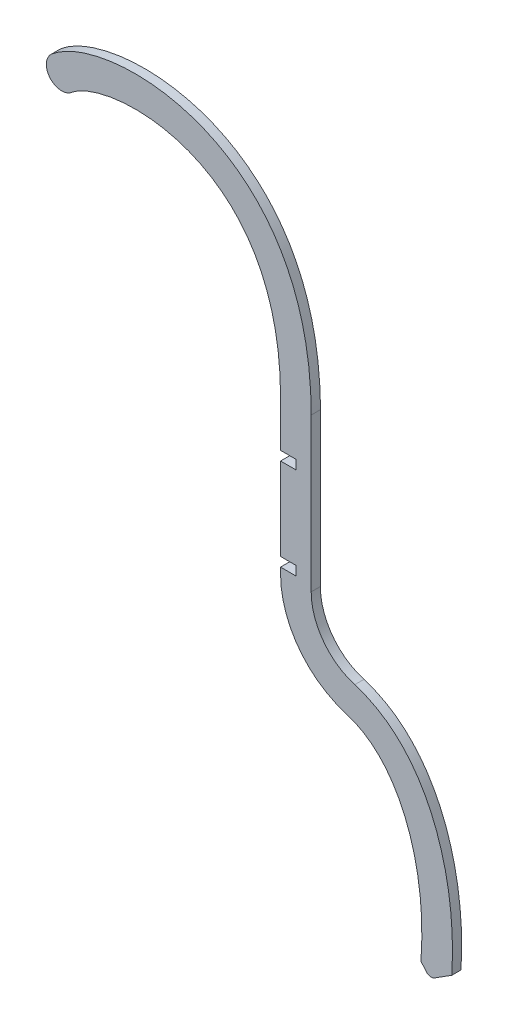
ISO-10303-21;
HEADER;
FILE_DESCRIPTION(('STEP AP214'),'2;1');
FILE_NAME('part.step','',(''),(''),'','','');
FILE_SCHEMA(('AUTOMOTIVE_DESIGN { 1 0 10303 214 1 1 1 1 }'));
ENDSEC;
DATA;
#1=APPLICATION_CONTEXT('core data for automotive mechanical design processes');
#2=APPLICATION_PROTOCOL_DEFINITION('international standard','automotive_design',2000,#1);
#3=PRODUCT_CONTEXT('',#1,'mechanical');
#4=PRODUCT('Part','Part','',(#3));
#5=PRODUCT_RELATED_PRODUCT_CATEGORY('part','',(#4));
#6=PRODUCT_DEFINITION_FORMATION('','',#4);
#7=PRODUCT_DEFINITION_CONTEXT('part definition',#1,'design');
#8=PRODUCT_DEFINITION('design','',#6,#7);
#9=PRODUCT_DEFINITION_SHAPE('','',#8);
#10=(LENGTH_UNIT() NAMED_UNIT(*) SI_UNIT(.MILLI.,.METRE.));
#11=(NAMED_UNIT(*) PLANE_ANGLE_UNIT() SI_UNIT($,.RADIAN.));
#12=(NAMED_UNIT(*) SI_UNIT($,.STERADIAN.) SOLID_ANGLE_UNIT());
#13=UNCERTAINTY_MEASURE_WITH_UNIT(LENGTH_MEASURE(1.E-05),#10,'distance_accuracy_value','');
#14=(GEOMETRIC_REPRESENTATION_CONTEXT(3) GLOBAL_UNCERTAINTY_ASSIGNED_CONTEXT((#13)) GLOBAL_UNIT_ASSIGNED_CONTEXT((#10,
#11,#12)) REPRESENTATION_CONTEXT('',''));
#15=CARTESIAN_POINT('',(0.,0.,0.));
#16=DIRECTION('',(0.,0.,1.));
#17=DIRECTION('',(1.,0.,0.));
#18=AXIS2_PLACEMENT_3D('',#15,#16,#17);
#19=CARTESIAN_POINT('',(30.2472330755642,111.105178128736,3.));
#20=DIRECTION('',(1.,0.,0.));
#21=DIRECTION('',(0.,1.,0.));
#22=AXIS2_PLACEMENT_3D('',#19,#20,#21);
#23=PLANE('',#22);
#24=DIRECTION('',(0.,0.,1.));
#25=VECTOR('',#24,1.);
#26=CARTESIAN_POINT('',(30.2472330755642,93.1051781287361,3.));
#27=LINE('',#26,#25);
#28=CARTESIAN_POINT('',(30.2472330755642,93.1051781287361,0.));
#29=VERTEX_POINT('',#28);
#30=CARTESIAN_POINT('',(30.2472330755642,93.1051781287361,3.));
#31=VERTEX_POINT('',#30);
#32=EDGE_CURVE('E300',#29,#31,#27,.T.);
#33=ORIENTED_EDGE('',*,*,#32,.F.);
#34=DIRECTION('',(0.,-1.,0.));
#35=VECTOR('',#34,1.);
#36=CARTESIAN_POINT('',(30.2472330755642,111.105178128736,0.));
#37=LINE('',#36,#35);
#38=CARTESIAN_POINT('',(30.2472330755642,66.1051781287361,0.));
#39=VERTEX_POINT('',#38);
#40=EDGE_CURVE('E380',#29,#39,#37,.T.);
#41=ORIENTED_EDGE('',*,*,#40,.T.);
#42=DIRECTION('',(0.,0.,1.));
#43=VECTOR('',#42,1.);
#44=CARTESIAN_POINT('',(30.2472330755642,66.1051781287361,3.));
#45=LINE('',#44,#43);
#46=CARTESIAN_POINT('',(30.2472330755642,66.1051781287361,3.));
#47=VERTEX_POINT('',#46);
#48=EDGE_CURVE('E295',#39,#47,#45,.T.);
#49=ORIENTED_EDGE('',*,*,#48,.T.);
#50=DIRECTION('',(0.,-1.,0.));
#51=VECTOR('',#50,1.);
#52=CARTESIAN_POINT('',(30.2472330755642,111.105178128736,3.));
#53=LINE('',#52,#51);
#54=EDGE_CURVE('E338',#31,#47,#53,.T.);
#55=ORIENTED_EDGE('',*,*,#54,.F.);
#56=EDGE_LOOP('',(#33,#41,#49,#55));
#57=FACE_BOUND('',#56,.T.);
#58=ADVANCED_FACE('F39',(#57),#23,.F.);
#59=DIRECTION('',(0.,0.,1.));
#60=VECTOR('',#59,1.);
#61=CARTESIAN_POINT('',(30.2472330755642,63.1051781287361,3.));
#62=LINE('',#61,#60);
#63=CARTESIAN_POINT('',(30.2472330755642,63.1051781287361,0.));
#64=VERTEX_POINT('',#63);
#65=CARTESIAN_POINT('',(30.2472330755642,63.1051781287361,3.));
#66=VERTEX_POINT('',#65);
#67=EDGE_CURVE('E270',#64,#66,#62,.T.);
#68=ORIENTED_EDGE('',*,*,#67,.F.);
#69=CARTESIAN_POINT('',(30.2472330755642,61.1051781287361,0.));
#70=VERTEX_POINT('',#69);
#71=EDGE_CURVE('E334',#64,#70,#37,.T.);
#72=ORIENTED_EDGE('',*,*,#71,.T.);
#73=DIRECTION('',(0.,0.,-1.));
#74=VECTOR('',#73,1.);
#75=CARTESIAN_POINT('',(30.2472330755642,61.1051781287361,3.));
#76=LINE('',#75,#74);
#77=CARTESIAN_POINT('',(30.2472330755642,61.1051781287361,3.));
#78=VERTEX_POINT('',#77);
#79=EDGE_CURVE('E429',#78,#70,#76,.T.);
#80=ORIENTED_EDGE('',*,*,#79,.F.);
#81=EDGE_CURVE('E339',#66,#78,#53,.T.);
#82=ORIENTED_EDGE('',*,*,#81,.F.);
#83=EDGE_LOOP('',(#68,#72,#80,#82));
#84=FACE_BOUND('',#83,.T.);
#85=ADVANCED_FACE('F368',(#84),#23,.F.);
#86=CARTESIAN_POINT('',(30.2472330755642,111.105178128736,0.));
#87=VERTEX_POINT('',#86);
#88=CARTESIAN_POINT('',(30.2472330755642,96.1051781287361,0.));
#89=VERTEX_POINT('',#88);
#90=EDGE_CURVE('E390',#87,#89,#37,.T.);
#91=ORIENTED_EDGE('',*,*,#90,.T.);
#92=DIRECTION('',(0.,0.,1.));
#93=VECTOR('',#92,1.);
#94=CARTESIAN_POINT('',(30.2472330755642,96.1051781287361,3.));
#95=LINE('',#94,#93);
#96=CARTESIAN_POINT('',(30.2472330755642,96.1051781287361,3.));
#97=VERTEX_POINT('',#96);
#98=EDGE_CURVE('E305',#89,#97,#95,.T.);
#99=ORIENTED_EDGE('',*,*,#98,.T.);
#100=CARTESIAN_POINT('',(30.2472330755642,111.105178128736,3.));
#101=VERTEX_POINT('',#100);
#102=EDGE_CURVE('E335',#101,#97,#53,.T.);
#103=ORIENTED_EDGE('',*,*,#102,.F.);
#104=DIRECTION('',(0.,0.,-1.));
#105=VECTOR('',#104,1.);
#106=CARTESIAN_POINT('',(30.2472330755642,111.105178128736,3.));
#107=LINE('',#106,#105);
#108=EDGE_CURVE('E216',#101,#87,#107,.T.);
#109=ORIENTED_EDGE('',*,*,#108,.T.);
#110=EDGE_LOOP('',(#91,#99,#103,#109));
#111=FACE_BOUND('',#110,.T.);
#112=ADVANCED_FACE('F41',(#111),#23,.F.);
#113=CARTESIAN_POINT('',(60.2472330755642,61.1051781287361,3.));
#114=DIRECTION('',(0.,0.,-1.));
#115=DIRECTION('',(-1.,0.,0.));
#116=AXIS2_PLACEMENT_3D('',#113,#114,#115);
#117=CYLINDRICAL_SURFACE('',#116,30.);
#118=CARTESIAN_POINT('',(60.2472330755642,61.1051781287361,0.));
#119=DIRECTION('',(0.,0.,1.));
#120=DIRECTION('',(1.,0.,0.));
#121=AXIS2_PLACEMENT_3D('',#118,#119,#120);
#122=CIRCLE('',#121,30.);
#123=CARTESIAN_POINT('',(51.5783245461013,32.3849757459567,0.));
#124=VERTEX_POINT('',#123);
#125=EDGE_CURVE('E393',#70,#124,#122,.T.);
#126=ORIENTED_EDGE('',*,*,#125,.T.);
#127=DIRECTION('',(0.,0.,-1.));
#128=VECTOR('',#127,1.);
#129=CARTESIAN_POINT('',(51.5783245461013,32.3849757459567,3.));
#130=LINE('',#129,#128);
#131=CARTESIAN_POINT('',(51.5783245461013,32.3849757459567,3.));
#132=VERTEX_POINT('',#131);
#133=EDGE_CURVE('E426',#132,#124,#130,.T.);
#134=ORIENTED_EDGE('',*,*,#133,.F.);
#135=CARTESIAN_POINT('',(60.2472330755642,61.1051781287361,3.));
#136=DIRECTION('',(0.,0.,1.));
#137=DIRECTION('',(1.,0.,0.));
#138=AXIS2_PLACEMENT_3D('',#135,#136,#137);
#139=CIRCLE('',#138,30.);
#140=EDGE_CURVE('E337',#78,#132,#139,.T.);
#141=ORIENTED_EDGE('',*,*,#140,.F.);
#142=ORIENTED_EDGE('',*,*,#79,.T.);
#143=EDGE_LOOP('',(#126,#134,#141,#142));
#144=FACE_BOUND('',#143,.T.);
#145=ADVANCED_FACE('F360',(#144),#117,.T.);
#146=CARTESIAN_POINT('',(51.5783245461013,32.3849757459567,3.));
#147=CARTESIAN_POINT('',(52.4418237474786,32.1243370675715,3.));
#148=CARTESIAN_POINT('',(54.160244695127,31.5041732941851,3.));
#149=CARTESIAN_POINT('',(57.3068480949443,29.9703545295423,3.));
#150=CARTESIAN_POINT('',(60.9092601517179,27.4640028905668,3.));
#151=CARTESIAN_POINT('',(64.7789113425041,23.4878427324668,3.));
#152=CARTESIAN_POINT('',(69.3337224846496,16.8889121106159,3.));
#153=CARTESIAN_POINT('',(73.7131899847158,6.38380492162644,3.));
#154=CARTESIAN_POINT('',(76.4393028225739,-8.61752881826473,3.));
#155=CARTESIAN_POINT('',(76.5234079166854,-21.8927167166831,3.));
#156=CARTESIAN_POINT('',(75.3368048169374,-32.2481326739936,3.));
#157=CARTESIAN_POINT('',(73.8512799930039,-39.6983401019073,3.));
#158=CARTESIAN_POINT('',(71.8117544691769,-46.6469231762444,3.));
#159=CARTESIAN_POINT('',(69.6998429414444,-51.8638052622201,3.));
#160=CARTESIAN_POINT('',(67.8067562733463,-55.6012721850078,3.));
#161=CARTESIAN_POINT('',(66.2988758888052,-58.1660065714299,3.));
#162=CARTESIAN_POINT('',(64.9856806027951,-60.0849481600171,3.));
#163=CARTESIAN_POINT('',(63.9040927418651,-61.4887999643172,3.));
#164=CARTESIAN_POINT('',(63.3660237976318,-62.1329634196774,3.));
#165=CARTESIAN_POINT('',(63.0865626162944,-62.4536589435812,3.));
#166=B_SPLINE_CURVE_WITH_KNOTS('',3,(#146,#147,#148,#149,#150,#151,#152,#153,#154,#155,#156,
#157,#158,#159,#160,#161,#162,#163,#164,#165),.UNSPECIFIED.,.F.,.F.,(4,1,1,1,1,1,1,1,1,1,1,1,1,
1,1,1,1,4),(0.0736016129873298,0.102551562581476,0.131501512175622,0.189401411363914,
0.247301310552205,0.305201209740497,0.421001008117081,0.536800806493665,0.652600604870249,
0.710500504058541,0.768400403246832,0.826300302435124,0.884200201623416,0.913150151217562,
0.942100100811708,0.971050050405854,0.985525025202927,1.),.UNSPECIFIED.);
#167=DIRECTION('',(0.,0.,-1.));
#168=VECTOR('',#167,1.);
#169=SURFACE_OF_LINEAR_EXTRUSION('',#166,#168);
#170=CARTESIAN_POINT('',(51.5783245461013,32.3849757459567,0.));
#171=CARTESIAN_POINT('',(52.4418237474786,32.1243370675715,0.));
#172=CARTESIAN_POINT('',(54.160244695127,31.5041732941851,0.));
#173=CARTESIAN_POINT('',(57.3068480949443,29.9703545295423,0.));
#174=CARTESIAN_POINT('',(60.9092601517179,27.4640028905668,0.));
#175=CARTESIAN_POINT('',(64.7789113425041,23.4878427324668,0.));
#176=CARTESIAN_POINT('',(69.3337224846496,16.8889121106159,0.));
#177=CARTESIAN_POINT('',(73.7131899847158,6.38380492162644,0.));
#178=CARTESIAN_POINT('',(76.4393028225739,-8.61752881826473,0.));
#179=CARTESIAN_POINT('',(76.5234079166854,-21.8927167166831,0.));
#180=CARTESIAN_POINT('',(75.3368048169374,-32.2481326739936,0.));
#181=CARTESIAN_POINT('',(73.8512799930039,-39.6983401019073,0.));
#182=CARTESIAN_POINT('',(71.8117544691769,-46.6469231762444,0.));
#183=CARTESIAN_POINT('',(69.6998429414444,-51.8638052622201,0.));
#184=CARTESIAN_POINT('',(67.8067562733463,-55.6012721850078,0.));
#185=CARTESIAN_POINT('',(66.2988758888052,-58.1660065714299,0.));
#186=CARTESIAN_POINT('',(64.9856806027951,-60.0849481600171,0.));
#187=CARTESIAN_POINT('',(63.9040927418651,-61.4887999643172,0.));
#188=CARTESIAN_POINT('',(63.3660237976318,-62.1329634196774,0.));
#189=CARTESIAN_POINT('',(63.0865626162944,-62.4536589435812,0.));
#190=B_SPLINE_CURVE_WITH_KNOTS('',3,(#170,#171,#172,#173,#174,#175,#176,#177,#178,#179,#180,
#181,#182,#183,#184,#185,#186,#187,#188,#189),.UNSPECIFIED.,.F.,.F.,(4,1,1,1,1,1,1,1,1,1,1,1,1,
1,1,1,1,4),(0.0736016129873298,0.102551562581476,0.131501512175622,0.189401411363914,
0.247301310552205,0.305201209740497,0.421001008117081,0.536800806493665,0.652600604870249,
0.710500504058541,0.768400403246832,0.826300302435124,0.884200201623416,0.913150151217562,
0.942100100811708,0.971050050405854,0.985525025202927,1.),.UNSPECIFIED.);
#191=CARTESIAN_POINT('',(76.0488444966909,-25.3953063540741,0.));
#192=VERTEX_POINT('',#191);
#193=EDGE_CURVE('E398',#124,#192,#190,.T.);
#194=ORIENTED_EDGE('',*,*,#193,.T.);
#195=DIRECTION('',(0.,0.,-1.));
#196=VECTOR('',#195,1.);
#197=CARTESIAN_POINT('',(76.0488444966956,-25.3953063540795,3.));
#198=LINE('',#197,#196);
#199=CARTESIAN_POINT('',(76.0488444966909,-25.3953063540741,3.));
#200=VERTEX_POINT('',#199);
#201=EDGE_CURVE('E331',#192,#200,#198,.F.);
#202=ORIENTED_EDGE('',*,*,#201,.T.);
#203=EDGE_CURVE('E341',#132,#200,#166,.T.);
#204=ORIENTED_EDGE('',*,*,#203,.F.);
#205=ORIENTED_EDGE('',*,*,#133,.T.);
#206=EDGE_LOOP('',(#194,#202,#204,#205));
#207=FACE_BOUND('',#206,.T.);
#208=ADVANCED_FACE('F356',(#207),#169,.F.);
#209=CARTESIAN_POINT('',(70.6256816408782,-69.0234142155192,3.));
#210=CARTESIAN_POINT('',(94.0603865040222,-42.1309316258111,3.));
#211=CARTESIAN_POINT('',(93.4691575994557,30.1862516868117,3.));
#212=CARTESIAN_POINT('',(54.4679607225889,41.9583765402165,3.));
#213=B_SPLINE_CURVE_WITH_KNOTS('',3,(#209,#210,#211,#212),.UNSPECIFIED.,.F.,.F.,(4,4),
(0.0736016129873298,1.),.UNSPECIFIED.);
#214=DIRECTION('',(0.,0.,-1.));
#215=VECTOR('',#214,1.);
#216=SURFACE_OF_LINEAR_EXTRUSION('',#213,#215);
#217=CARTESIAN_POINT('',(86.1515531886918,-24.38839271404,3.));
#218=VERTEX_POINT('',#217);
#219=CARTESIAN_POINT('',(54.4679607225889,41.9583765402165,3.));
#220=VERTEX_POINT('',#219);
#221=EDGE_CURVE('E347',#218,#220,#213,.T.);
#222=ORIENTED_EDGE('',*,*,#221,.F.);
#223=DIRECTION('',(0.,0.,-1.));
#224=VECTOR('',#223,1.);
#225=CARTESIAN_POINT('',(86.1515531888008,-24.3883927139711,3.));
#226=LINE('',#225,#224);
#227=CARTESIAN_POINT('',(86.1515531886918,-24.38839271404,0.));
#228=VERTEX_POINT('',#227);
#229=EDGE_CURVE('E326',#218,#228,#226,.T.);
#230=ORIENTED_EDGE('',*,*,#229,.T.);
#231=CARTESIAN_POINT('',(70.6256816408782,-69.0234142155192,0.));
#232=CARTESIAN_POINT('',(94.0603865040222,-42.1309316258111,0.));
#233=CARTESIAN_POINT('',(93.4691575994557,30.1862516868117,0.));
#234=CARTESIAN_POINT('',(54.4679607225889,41.9583765402165,0.));
#235=B_SPLINE_CURVE_WITH_KNOTS('',3,(#231,#232,#233,#234),.UNSPECIFIED.,.F.,.F.,(4,4),
(0.0736016129873298,1.),.UNSPECIFIED.);
#236=CARTESIAN_POINT('',(54.4679607225889,41.9583765402165,0.));
#237=VERTEX_POINT('',#236);
#238=EDGE_CURVE('E403',#228,#237,#235,.T.);
#239=ORIENTED_EDGE('',*,*,#238,.T.);
#240=DIRECTION('',(0.,0.,-1.));
#241=VECTOR('',#240,1.);
#242=CARTESIAN_POINT('',(54.4679607225889,41.9583765402165,3.));
#243=LINE('',#242,#241);
#244=EDGE_CURVE('E423',#220,#237,#243,.T.);
#245=ORIENTED_EDGE('',*,*,#244,.F.);
#246=EDGE_LOOP('',(#222,#230,#239,#245));
#247=FACE_BOUND('',#246,.T.);
#248=ADVANCED_FACE('F359',(#247),#216,.F.);
#249=CARTESIAN_POINT('',(60.2472330755642,61.1051781287361,3.));
#250=DIRECTION('',(0.,0.,-1.));
#251=DIRECTION('',(-1.,0.,0.));
#252=AXIS2_PLACEMENT_3D('',#249,#250,#251);
#253=CYLINDRICAL_SURFACE('',#252,20.);
#254=CARTESIAN_POINT('',(60.2472330755642,61.1051781287361,0.));
#255=DIRECTION('',(0.,0.,-1.));
#256=DIRECTION('',(1.,0.,0.));
#257=AXIS2_PLACEMENT_3D('',#254,#255,#256);
#258=CIRCLE('',#257,20.);
#259=CARTESIAN_POINT('',(40.2472330755642,61.1051781287361,0.));
#260=VERTEX_POINT('',#259);
#261=EDGE_CURVE('E410',#237,#260,#258,.T.);
#262=ORIENTED_EDGE('',*,*,#261,.T.);
#263=DIRECTION('',(0.,0.,-1.));
#264=VECTOR('',#263,1.);
#265=CARTESIAN_POINT('',(40.2472330755642,61.1051781287361,3.));
#266=LINE('',#265,#264);
#267=CARTESIAN_POINT('',(40.2472330755642,61.1051781287361,3.));
#268=VERTEX_POINT('',#267);
#269=EDGE_CURVE('E420',#268,#260,#266,.T.);
#270=ORIENTED_EDGE('',*,*,#269,.F.);
#271=CARTESIAN_POINT('',(60.2472330755642,61.1051781287361,3.));
#272=DIRECTION('',(0.,0.,-1.));
#273=DIRECTION('',(1.,0.,0.));
#274=AXIS2_PLACEMENT_3D('',#271,#272,#273);
#275=CIRCLE('',#274,20.);
#276=EDGE_CURVE('E693',#220,#268,#275,.T.);
#277=ORIENTED_EDGE('',*,*,#276,.F.);
#278=ORIENTED_EDGE('',*,*,#244,.T.);
#279=EDGE_LOOP('',(#262,#270,#277,#278));
#280=FACE_BOUND('',#279,.T.);
#281=ADVANCED_FACE('F512',(#280),#253,.F.);
#282=CARTESIAN_POINT('',(40.2472330755642,111.105178128736,3.));
#283=DIRECTION('',(-1.,0.,0.));
#284=DIRECTION('',(0.,-1.,0.));
#285=AXIS2_PLACEMENT_3D('',#282,#283,#284);
#286=PLANE('',#285);
#287=DIRECTION('',(0.,1.,0.));
#288=VECTOR('',#287,1.);
#289=CARTESIAN_POINT('',(40.2472330755642,111.105178128736,0.));
#290=LINE('',#289,#288);
#291=CARTESIAN_POINT('',(40.2472330755642,111.105178128736,0.));
#292=VERTEX_POINT('',#291);
#293=EDGE_CURVE('E415',#260,#292,#290,.T.);
#294=ORIENTED_EDGE('',*,*,#293,.T.);
#295=DIRECTION('',(0.,0.,-1.));
#296=VECTOR('',#295,1.);
#297=CARTESIAN_POINT('',(40.2472330755642,111.105178128736,3.));
#298=LINE('',#297,#296);
#299=CARTESIAN_POINT('',(40.2472330755642,111.105178128736,3.));
#300=VERTEX_POINT('',#299);
#301=EDGE_CURVE('E417',#300,#292,#298,.T.);
#302=ORIENTED_EDGE('',*,*,#301,.F.);
#303=DIRECTION('',(0.,1.,0.));
#304=VECTOR('',#303,1.);
#305=CARTESIAN_POINT('',(40.2472330755642,111.105178128736,3.));
#306=LINE('',#305,#304);
#307=EDGE_CURVE('E396',#268,#300,#306,.T.);
#308=ORIENTED_EDGE('',*,*,#307,.F.);
#309=ORIENTED_EDGE('',*,*,#269,.T.);
#310=EDGE_LOOP('',(#294,#302,#308,#309));
#311=FACE_BOUND('',#310,.T.);
#312=ADVANCED_FACE('F508',(#311),#286,.F.);
#313=CARTESIAN_POINT('',(60.2472330755642,61.1051781287361,3.));
#314=DIRECTION('',(0.,0.,1.));
#315=DIRECTION('',(1.,0.,0.));
#316=AXIS2_PLACEMENT_3D('',#313,#314,#315);
#317=PLANE('',#316);
#318=DIRECTION('',(-1.,0.,0.));
#319=VECTOR('',#318,1.);
#320=CARTESIAN_POINT('',(60.2472330755642,96.1051781287361,3.));
#321=LINE('',#320,#319);
#322=CARTESIAN_POINT('',(35.2472330755643,96.1051781287361,3.00000000000034));
#323=VERTEX_POINT('',#322);
#324=EDGE_CURVE('E308',#323,#97,#321,.T.);
#325=ORIENTED_EDGE('',*,*,#324,.F.);
#326=DIRECTION('',(0.,1.,0.));
#327=VECTOR('',#326,1.);
#328=CARTESIAN_POINT('',(35.2472330755643,93.1041781287361,3.00000000000034));
#329=LINE('',#328,#327);
#330=CARTESIAN_POINT('',(35.2472330755643,93.1051781287361,3.00000000000034));
#331=VERTEX_POINT('',#330);
#332=EDGE_CURVE('E262',#331,#323,#329,.T.);
#333=ORIENTED_EDGE('',*,*,#332,.F.);
#334=DIRECTION('',(-1.,0.,0.));
#335=VECTOR('',#334,1.);
#336=CARTESIAN_POINT('',(60.2472330755642,93.1051781287361,3.));
#337=LINE('',#336,#335);
#338=EDGE_CURVE('E302',#331,#31,#337,.T.);
#339=ORIENTED_EDGE('',*,*,#338,.T.);
#340=ORIENTED_EDGE('',*,*,#54,.T.);
#341=DIRECTION('',(-1.,0.,0.));
#342=VECTOR('',#341,1.);
#343=CARTESIAN_POINT('',(60.2472330755642,66.1051781287361,3.));
#344=LINE('',#343,#342);
#345=CARTESIAN_POINT('',(35.2472330755642,66.1051781287361,3.00000000000001));
#346=VERTEX_POINT('',#345);
#347=EDGE_CURVE('E298',#346,#47,#344,.T.);
#348=ORIENTED_EDGE('',*,*,#347,.F.);
#349=DIRECTION('',(0.,1.,0.));
#350=VECTOR('',#349,1.);
#351=CARTESIAN_POINT('',(35.2472330755642,63.1041781287361,3.00000000000001));
#352=LINE('',#351,#350);
#353=CARTESIAN_POINT('',(35.2472330755642,63.1051781287361,3.00000000000001));
#354=VERTEX_POINT('',#353);
#355=EDGE_CURVE('E283',#354,#346,#352,.T.);
#356=ORIENTED_EDGE('',*,*,#355,.F.);
#357=DIRECTION('',(-1.,0.,0.));
#358=VECTOR('',#357,1.);
#359=CARTESIAN_POINT('',(60.2472330755642,63.1051781287361,3.));
#360=LINE('',#359,#358);
#361=EDGE_CURVE('E292',#354,#66,#360,.T.);
#362=ORIENTED_EDGE('',*,*,#361,.T.);
#363=ORIENTED_EDGE('',*,*,#81,.T.);
#364=ORIENTED_EDGE('',*,*,#140,.T.);
#365=ORIENTED_EDGE('',*,*,#203,.T.);
#366=DIRECTION('',(-0.644870939209569,0.764291483508071,0.));
#367=VECTOR('',#366,1.);
#368=CARTESIAN_POINT('',(72.6750956175646,-21.3967891639962,3.));
#369=LINE('',#368,#367);
#370=CARTESIAN_POINT('',(77.8831884325907,-27.5693436114379,3.));
#371=VERTEX_POINT('',#370);
#372=EDGE_CURVE('E315',#371,#200,#369,.T.);
#373=ORIENTED_EDGE('',*,*,#372,.F.);
#374=CARTESIAN_POINT('',(79.4117713996068,-26.2796017330188,3.));
#375=DIRECTION('',(0.,0.,-1.));
#376=DIRECTION('',(1.,0.,0.));
#377=AXIS2_PLACEMENT_3D('',#374,#375,#376);
#378=CIRCLE('',#377,2.);
#379=CARTESIAN_POINT('',(80.4797573823835,-27.9705795390802,3.));
#380=VERTEX_POINT('',#379);
#381=EDGE_CURVE('E320',#380,#371,#378,.T.);
#382=ORIENTED_EDGE('',*,*,#381,.F.);
#383=DIRECTION('',(-0.845488903030735,-0.533992991388355,0.));
#384=VECTOR('',#383,1.);
#385=CARTESIAN_POINT('',(80.4797573823835,-27.9705795390802,3.));
#386=LINE('',#385,#384);
#387=EDGE_CURVE('E310',#218,#380,#386,.T.);
#388=ORIENTED_EDGE('',*,*,#387,.F.);
#389=ORIENTED_EDGE('',*,*,#221,.T.);
#390=ORIENTED_EDGE('',*,*,#276,.T.);
#391=ORIENTED_EDGE('',*,*,#307,.T.);
#392=CARTESIAN_POINT('',(-44.4536110350656,170.85805574764,3.));
#393=CARTESIAN_POINT('',(-25.539277275253,186.769628817352,3.));
#394=CARTESIAN_POINT('',(40.2472330755642,184.874305638382,3.));
#395=CARTESIAN_POINT('',(40.2472330755642,111.105178128736,3.));
#396=B_SPLINE_CURVE_WITH_KNOTS('',3,(#392,#393,#394,#395),.UNSPECIFIED.,.F.,.F.,(4,4),(0.,1.),.UNSPECIFIED.);
#397=CARTESIAN_POINT('',(-44.4536110350655,170.85805574764,3.));
#398=VERTEX_POINT('',#397);
#399=EDGE_CURVE('E219',#398,#300,#396,.T.);
#400=ORIENTED_EDGE('',*,*,#399,.F.);
#401=CARTESIAN_POINT('',(-41.2348603986622,167.03187693051,3.));
#402=DIRECTION('',(0.,0.,-1.));
#403=DIRECTION('',(-1.,0.,0.));
#404=AXIS2_PLACEMENT_3D('',#401,#402,#403);
#405=CIRCLE('',#404,5.00000000000001);
#406=CARTESIAN_POINT('',(-38.0161097622588,163.205698113381,3.));
#407=VERTEX_POINT('',#406);
#408=EDGE_CURVE('E204',#407,#398,#405,.T.);
#409=ORIENTED_EDGE('',*,*,#408,.F.);
#410=CARTESIAN_POINT('',(30.2472330755642,111.105178128736,3.));
#411=CARTESIAN_POINT('',(30.2472330755642,112.145969650255,3.));
#412=CARTESIAN_POINT('',(30.2176984928871,114.254725220172,3.));
#413=CARTESIAN_POINT('',(30.0450143284702,118.252405482468,3.));
#414=CARTESIAN_POINT('',(29.6246745478574,122.993020115073,3.));
#415=CARTESIAN_POINT('',(28.8206564068478,128.23655426111,3.));
#416=CARTESIAN_POINT('',(27.744472909704,133.06268662543,3.));
#417=CARTESIAN_POINT('',(26.4229171689106,137.485210513076,3.));
#418=CARTESIAN_POINT('',(24.3672310117831,142.870966443796,3.));
#419=CARTESIAN_POINT('',(21.306772787848,148.697507946256,3.));
#420=CARTESIAN_POINT('',(17.0017194297767,154.423085647227,3.));
#421=CARTESIAN_POINT('',(12.1687437472045,159.053182078316,3.));
#422=CARTESIAN_POINT('',(6.88641274853583,162.716784457252,3.));
#423=CARTESIAN_POINT('',(-0.639998698778879,166.423733084259,3.));
#424=CARTESIAN_POINT('',(-8.67921261984271,168.465694520347,3.));
#425=CARTESIAN_POINT('',(-16.6033621223443,169.02250982884,3.));
#426=CARTESIAN_POINT('',(-22.2932836851135,168.760231200628,3.));
#427=CARTESIAN_POINT('',(-27.5269744892151,167.899846277132,3.));
#428=CARTESIAN_POINT('',(-31.3250941836693,166.776800639684,3.));
#429=CARTESIAN_POINT('',(-33.908111954483,165.718326704366,3.));
#430=CARTESIAN_POINT('',(-35.5894740712454,164.87294127367,3.));
#431=CARTESIAN_POINT('',(-36.748498995835,164.160369863656,3.));
#432=CARTESIAN_POINT('',(-37.5309442860598,163.599193526955,3.));
#433=CARTESIAN_POINT('',(-37.8522994250323,163.34350260512,3.));
#434=CARTESIAN_POINT('',(-38.0161097622588,163.205698113381,3.));
#435=B_SPLINE_CURVE_WITH_KNOTS('',3,(#410,#411,#412,#413,#414,#415,#416,#417,#418,#419,#420,
#421,#422,#423,#424,#425,#426,#427,#428,#429,#430,#431,#432,#433,#434),.UNSPECIFIED.,.F.,.F.,(4,
1,1,1,1,1,1,1,1,1,1,1,1,1,1,1,1,1,1,1,1,1,4),(0.,0.015625,0.03125,0.0625,0.09375,0.125,0.15625,
0.1875,0.25,0.3125,0.375,0.4375,0.5,0.625,0.6875,0.75,0.8125,0.875,0.90625,0.9375,0.96875,
0.984375,1.),.UNSPECIFIED.);
#436=EDGE_CURVE('E214',#101,#407,#435,.T.);
#437=ORIENTED_EDGE('',*,*,#436,.F.);
#438=ORIENTED_EDGE('',*,*,#102,.T.);
#439=EDGE_LOOP('',(#325,#333,#339,#340,#348,#356,#362,#363,#364,#365,#373,#382,#388,#389,#390,
#391,#400,#409,#437,#438));
#440=FACE_BOUND('',#439,.T.);
#441=ADVANCED_FACE('F223',(#440),#317,.T.);
#442=CARTESIAN_POINT('',(60.2472330755642,61.1051781287361,0.));
#443=DIRECTION('',(0.,0.,1.));
#444=DIRECTION('',(1.,0.,0.));
#445=AXIS2_PLACEMENT_3D('',#442,#443,#444);
#446=PLANE('',#445);
#447=DIRECTION('',(0.,-1.,0.));
#448=VECTOR('',#447,1.);
#449=CARTESIAN_POINT('',(40.2152202653166,96.1051781287361,0.));
#450=LINE('',#449,#448);
#451=CARTESIAN_POINT('',(40.2152202653166,96.1051781287361,0.));
#452=VERTEX_POINT('',#451);
#453=CARTESIAN_POINT('',(40.2152202653166,93.1051781287361,0.));
#454=VERTEX_POINT('',#453);
#455=EDGE_CURVE('E47',#452,#454,#450,.T.);
#456=ORIENTED_EDGE('',*,*,#455,.F.);
#457=DIRECTION('',(-1.,0.,0.));
#458=VECTOR('',#457,1.);
#459=CARTESIAN_POINT('',(60.2472330755642,96.1051781287361,0.));
#460=LINE('',#459,#458);
#461=EDGE_CURVE('E11',#452,#89,#460,.T.);
#462=ORIENTED_EDGE('',*,*,#461,.T.);
#463=ORIENTED_EDGE('',*,*,#90,.F.);
#464=CARTESIAN_POINT('',(30.2472330755642,111.105178128736,0.));
#465=CARTESIAN_POINT('',(30.2472330755642,112.145969650255,0.));
#466=CARTESIAN_POINT('',(30.2176984928871,114.254725220172,0.));
#467=CARTESIAN_POINT('',(30.0450143284702,118.252405482468,0.));
#468=CARTESIAN_POINT('',(29.6246745478574,122.993020115073,0.));
#469=CARTESIAN_POINT('',(28.8206564068478,128.23655426111,0.));
#470=CARTESIAN_POINT('',(27.744472909704,133.06268662543,0.));
#471=CARTESIAN_POINT('',(26.4229171689106,137.485210513076,0.));
#472=CARTESIAN_POINT('',(24.3672310117831,142.870966443796,0.));
#473=CARTESIAN_POINT('',(21.306772787848,148.697507946256,0.));
#474=CARTESIAN_POINT('',(17.0017194297767,154.423085647227,0.));
#475=CARTESIAN_POINT('',(12.1687437472045,159.053182078316,0.));
#476=CARTESIAN_POINT('',(6.88641274853583,162.716784457252,0.));
#477=CARTESIAN_POINT('',(-0.639998698778879,166.423733084259,0.));
#478=CARTESIAN_POINT('',(-8.67921261984271,168.465694520347,0.));
#479=CARTESIAN_POINT('',(-16.6033621223443,169.02250982884,0.));
#480=CARTESIAN_POINT('',(-22.2932836851135,168.760231200628,0.));
#481=CARTESIAN_POINT('',(-27.5269744892151,167.899846277132,0.));
#482=CARTESIAN_POINT('',(-31.3250941836693,166.776800639684,0.));
#483=CARTESIAN_POINT('',(-33.908111954483,165.718326704366,0.));
#484=CARTESIAN_POINT('',(-35.5894740712454,164.87294127367,0.));
#485=CARTESIAN_POINT('',(-36.748498995835,164.160369863656,0.));
#486=CARTESIAN_POINT('',(-37.5309442860598,163.599193526955,0.));
#487=CARTESIAN_POINT('',(-37.8522994250323,163.34350260512,0.));
#488=CARTESIAN_POINT('',(-38.0161097622588,163.205698113381,0.));
#489=B_SPLINE_CURVE_WITH_KNOTS('',3,(#464,#465,#466,#467,#468,#469,#470,#471,#472,#473,#474,
#475,#476,#477,#478,#479,#480,#481,#482,#483,#484,#485,#486,#487,#488),.UNSPECIFIED.,.F.,.F.,(4,
1,1,1,1,1,1,1,1,1,1,1,1,1,1,1,1,1,1,1,1,1,4),(0.,0.015625,0.03125,0.0625,0.09375,0.125,0.15625,
0.1875,0.25,0.3125,0.375,0.4375,0.5,0.625,0.6875,0.75,0.8125,0.875,0.90625,0.9375,0.96875,
0.984375,1.),.UNSPECIFIED.);
#490=CARTESIAN_POINT('',(-38.0161097622588,163.205698113381,0.));
#491=VERTEX_POINT('',#490);
#492=EDGE_CURVE('E236',#87,#491,#489,.T.);
#493=ORIENTED_EDGE('',*,*,#492,.T.);
#494=CARTESIAN_POINT('',(-41.2348603986622,167.03187693051,0.));
#495=DIRECTION('',(0.,0.,-1.));
#496=DIRECTION('',(-1.,0.,0.));
#497=AXIS2_PLACEMENT_3D('',#494,#495,#496);
#498=CIRCLE('',#497,5.00000000000001);
#499=CARTESIAN_POINT('',(-44.4536110350655,170.85805574764,0.));
#500=VERTEX_POINT('',#499);
#501=EDGE_CURVE('E206',#491,#500,#498,.T.);
#502=ORIENTED_EDGE('',*,*,#501,.T.);
#503=CARTESIAN_POINT('',(-44.4536110350656,170.85805574764,0.));
#504=CARTESIAN_POINT('',(-25.539277275253,186.769628817352,0.));
#505=CARTESIAN_POINT('',(40.2472330755642,184.874305638382,0.));
#506=CARTESIAN_POINT('',(40.2472330755642,111.105178128736,0.));
#507=B_SPLINE_CURVE_WITH_KNOTS('',3,(#503,#504,#505,#506),.UNSPECIFIED.,.F.,.F.,(4,4),(0.,1.),.UNSPECIFIED.);
#508=EDGE_CURVE('E231',#500,#292,#507,.T.);
#509=ORIENTED_EDGE('',*,*,#508,.T.);
#510=ORIENTED_EDGE('',*,*,#293,.F.);
#511=ORIENTED_EDGE('',*,*,#261,.F.);
#512=ORIENTED_EDGE('',*,*,#238,.F.);
#513=DIRECTION('',(-0.845488903030735,-0.533992991388355,0.));
#514=VECTOR('',#513,1.);
#515=CARTESIAN_POINT('',(106.232889013102,-11.7054437722946,0.));
#516=LINE('',#515,#514);
#517=CARTESIAN_POINT('',(80.4797573823835,-27.9705795390802,0.));
#518=VERTEX_POINT('',#517);
#519=EDGE_CURVE('E433',#228,#518,#516,.T.);
#520=ORIENTED_EDGE('',*,*,#519,.T.);
#521=CARTESIAN_POINT('',(79.4117713996068,-26.2796017330188,0.));
#522=DIRECTION('',(0.,0.,-1.));
#523=DIRECTION('',(1.,0.,0.));
#524=AXIS2_PLACEMENT_3D('',#521,#522,#523);
#525=CIRCLE('',#524,2.);
#526=CARTESIAN_POINT('',(77.8831884325907,-27.5693436114379,0.));
#527=VERTEX_POINT('',#526);
#528=EDGE_CURVE('E311',#518,#527,#525,.T.);
#529=ORIENTED_EDGE('',*,*,#528,.T.);
#530=DIRECTION('',(-0.644870939209569,0.764291483508071,0.));
#531=VECTOR('',#530,1.);
#532=CARTESIAN_POINT('',(72.6750956175646,-21.3967891639962,0.));
#533=LINE('',#532,#531);
#534=EDGE_CURVE('E314',#527,#192,#533,.T.);
#535=ORIENTED_EDGE('',*,*,#534,.T.);
#536=ORIENTED_EDGE('',*,*,#193,.F.);
#537=ORIENTED_EDGE('',*,*,#125,.F.);
#538=ORIENTED_EDGE('',*,*,#71,.F.);
#539=DIRECTION('',(-1.,0.,0.));
#540=VECTOR('',#539,1.);
#541=CARTESIAN_POINT('',(60.2472330755642,63.1051781287361,0.));
#542=LINE('',#541,#540);
#543=CARTESIAN_POINT('',(40.2152202653165,63.1051781287361,0.));
#544=VERTEX_POINT('',#543);
#545=EDGE_CURVE('E436',#544,#64,#542,.T.);
#546=ORIENTED_EDGE('',*,*,#545,.F.);
#547=DIRECTION('',(0.,-1.,0.));
#548=VECTOR('',#547,1.);
#549=CARTESIAN_POINT('',(40.2152202653165,66.1051781287361,0.));
#550=LINE('',#549,#548);
#551=CARTESIAN_POINT('',(40.2152202653165,66.1051781287361,0.));
#552=VERTEX_POINT('',#551);
#553=EDGE_CURVE('E438',#552,#544,#550,.T.);
#554=ORIENTED_EDGE('',*,*,#553,.F.);
#555=DIRECTION('',(-1.,0.,0.));
#556=VECTOR('',#555,1.);
#557=CARTESIAN_POINT('',(60.2472330755642,66.1051781287361,0.));
#558=LINE('',#557,#556);
#559=EDGE_CURVE('E389',#552,#39,#558,.T.);
#560=ORIENTED_EDGE('',*,*,#559,.T.);
#561=ORIENTED_EDGE('',*,*,#40,.F.);
#562=DIRECTION('',(-1.,0.,0.));
#563=VECTOR('',#562,1.);
#564=CARTESIAN_POINT('',(60.2472330755642,93.1051781287361,0.));
#565=LINE('',#564,#563);
#566=EDGE_CURVE('E387',#454,#29,#565,.T.);
#567=ORIENTED_EDGE('',*,*,#566,.F.);
#568=EDGE_LOOP('',(#456,#462,#463,#493,#502,#509,#510,#511,#512,#520,#529,#535,#536,#537,#538,
#546,#554,#560,#561,#567));
#569=FACE_BOUND('',#568,.T.);
#570=ADVANCED_FACE('F386',(#569),#446,.F.);
#571=CARTESIAN_POINT('',(72.6750956175646,-21.3967891639962,0.));
#572=DIRECTION('',(0.764291483508071,0.644870939209569,0.));
#573=DIRECTION('',(-0.644870939209569,0.764291483508071,0.));
#574=AXIS2_PLACEMENT_3D('',#571,#572,#573);
#575=PLANE('',#574);
#576=ORIENTED_EDGE('',*,*,#534,.F.);
#577=DIRECTION('',(0.,0.,1.));
#578=VECTOR('',#577,1.);
#579=CARTESIAN_POINT('',(77.8831884325907,-27.5693436114379,0.));
#580=LINE('',#579,#578);
#581=EDGE_CURVE('E324',#527,#371,#580,.T.);
#582=ORIENTED_EDGE('',*,*,#581,.T.);
#583=ORIENTED_EDGE('',*,*,#372,.T.);
#584=ORIENTED_EDGE('',*,*,#201,.F.);
#585=EDGE_LOOP('',(#576,#582,#583,#584));
#586=FACE_BOUND('',#585,.T.);
#587=ADVANCED_FACE('F495',(#586),#575,.F.);
#588=CARTESIAN_POINT('',(80.4797573823835,-27.9705795390802,0.));
#589=DIRECTION('',(-0.533992991388355,0.845488903030735,0.));
#590=DIRECTION('',(-0.845488903030735,-0.533992991388355,0.));
#591=AXIS2_PLACEMENT_3D('',#588,#589,#590);
#592=PLANE('',#591);
#593=ORIENTED_EDGE('',*,*,#387,.T.);
#594=DIRECTION('',(0.,0.,1.));
#595=VECTOR('',#594,1.);
#596=CARTESIAN_POINT('',(80.4797573823835,-27.9705795390802,0.));
#597=LINE('',#596,#595);
#598=EDGE_CURVE('E318',#518,#380,#597,.T.);
#599=ORIENTED_EDGE('',*,*,#598,.F.);
#600=ORIENTED_EDGE('',*,*,#519,.F.);
#601=ORIENTED_EDGE('',*,*,#229,.F.);
#602=EDGE_LOOP('',(#593,#599,#600,#601));
#603=FACE_BOUND('',#602,.T.);
#604=ADVANCED_FACE('F498',(#603),#592,.F.);
#605=CARTESIAN_POINT('',(79.4117713996068,-26.2796017330188,0.));
#606=DIRECTION('',(0.,0.,1.));
#607=DIRECTION('',(1.,0.,0.));
#608=AXIS2_PLACEMENT_3D('',#605,#606,#607);
#609=CYLINDRICAL_SURFACE('',#608,2.);
#610=ORIENTED_EDGE('',*,*,#381,.T.);
#611=ORIENTED_EDGE('',*,*,#581,.F.);
#612=ORIENTED_EDGE('',*,*,#528,.F.);
#613=ORIENTED_EDGE('',*,*,#598,.T.);
#614=EDGE_LOOP('',(#610,#611,#612,#613));
#615=FACE_BOUND('',#614,.T.);
#616=ADVANCED_FACE('F493',(#615),#609,.T.);
#617=CARTESIAN_POINT('',(0.247233075567913,66.1051781287361,1.60000000002818));
#618=DIRECTION('',(0.,-1.,0.));
#619=DIRECTION('',(-0.939692620785908,0.,0.342020143325669));
#620=AXIS2_PLACEMENT_3D('',#617,#618,#619);
#621=CYLINDRICAL_SURFACE('',#620,40.);
#622=ORIENTED_EDGE('',*,*,#553,.T.);
#623=CARTESIAN_POINT('',(0.247233075567913,63.1051781287361,1.60000000002818));
#624=DIRECTION('',(0.,1.,0.));
#625=DIRECTION('',(0.939692620785908,0.,-0.342020143325669));
#626=AXIS2_PLACEMENT_3D('',#623,#624,#625);
#627=CIRCLE('',#626,40.);
#628=CARTESIAN_POINT('',(40.2227255678427,63.1051781287361,0.200000000000007));
#629=VERTEX_POINT('',#628);
#630=EDGE_CURVE('E62',#629,#544,#627,.T.);
#631=ORIENTED_EDGE('',*,*,#630,.F.);
#632=DIRECTION('',(0.,-1.,0.));
#633=VECTOR('',#632,1.);
#634=CARTESIAN_POINT('',(40.2227255678428,66.1051781287361,0.200000000000007));
#635=LINE('',#634,#633);
#636=CARTESIAN_POINT('',(40.2227255678428,66.1051781287361,0.200000000000007));
#637=VERTEX_POINT('',#636);
#638=EDGE_CURVE('E247',#629,#637,#635,.F.);
#639=ORIENTED_EDGE('',*,*,#638,.T.);
#640=CARTESIAN_POINT('',(0.247233075567913,66.1051781287361,1.60000000002818));
#641=DIRECTION('',(0.,1.,0.));
#642=DIRECTION('',(0.939692620785908,0.,-0.342020143325669));
#643=AXIS2_PLACEMENT_3D('',#640,#641,#642);
#644=CIRCLE('',#643,40.);
#645=EDGE_CURVE('E252',#637,#552,#644,.T.);
#646=ORIENTED_EDGE('',*,*,#645,.T.);
#647=EDGE_LOOP('',(#622,#631,#639,#646));
#648=FACE_BOUND('',#647,.T.);
#649=ADVANCED_FACE('F487',(#648),#621,.F.);
#650=CARTESIAN_POINT('',(0.247233075567913,66.1051781287361,1.60000000002818));
#651=DIRECTION('',(0.,1.,0.));
#652=DIRECTION('',(0.939692620785908,0.,-0.342020143325669));
#653=AXIS2_PLACEMENT_3D('',#650,#651,#652);
#654=PLANE('',#653);
#655=ORIENTED_EDGE('',*,*,#347,.T.);
#656=ORIENTED_EDGE('',*,*,#48,.F.);
#657=ORIENTED_EDGE('',*,*,#559,.F.);
#658=ORIENTED_EDGE('',*,*,#645,.F.);
#659=DIRECTION('',(-1.,0.,0.));
#660=VECTOR('',#659,1.);
#661=CARTESIAN_POINT('',(40.2472330755642,66.1051781287361,0.200000000000009));
#662=LINE('',#661,#660);
#663=CARTESIAN_POINT('',(35.2472330755642,66.1051781287361,0.200000000000009));
#664=VERTEX_POINT('',#663);
#665=EDGE_CURVE('E276',#637,#664,#662,.T.);
#666=ORIENTED_EDGE('',*,*,#665,.T.);
#667=DIRECTION('',(0.,0.,1.));
#668=VECTOR('',#667,1.);
#669=CARTESIAN_POINT('',(35.2472330755642,66.1051781287361,3.00000000000001));
#670=LINE('',#669,#668);
#671=EDGE_CURVE('E279',#664,#346,#670,.T.);
#672=ORIENTED_EDGE('',*,*,#671,.T.);
#673=EDGE_LOOP('',(#655,#656,#657,#658,#666,#672));
#674=FACE_BOUND('',#673,.T.);
#675=ADVANCED_FACE('F484',(#674),#654,.F.);
#676=CARTESIAN_POINT('',(0.247233075567913,63.1051781287361,1.60000000002818));
#677=DIRECTION('',(0.,1.,0.));
#678=DIRECTION('',(0.939692620785908,0.,-0.342020143325669));
#679=AXIS2_PLACEMENT_3D('',#676,#677,#678);
#680=PLANE('',#679);
#681=DIRECTION('',(0.,0.,-1.));
#682=VECTOR('',#681,1.);
#683=CARTESIAN_POINT('',(35.2472330755642,63.1051781287361,3.00000000000001));
#684=LINE('',#683,#682);
#685=CARTESIAN_POINT('',(35.2472330755642,63.1051781287361,0.200000000000009));
#686=VERTEX_POINT('',#685);
#687=EDGE_CURVE('E273',#354,#686,#684,.T.);
#688=ORIENTED_EDGE('',*,*,#687,.T.);
#689=DIRECTION('',(1.,0.,0.));
#690=VECTOR('',#689,1.);
#691=CARTESIAN_POINT('',(40.2472330755642,63.1051781287361,0.200000000000009));
#692=LINE('',#691,#690);
#693=EDGE_CURVE('E285',#686,#629,#692,.T.);
#694=ORIENTED_EDGE('',*,*,#693,.T.);
#695=ORIENTED_EDGE('',*,*,#630,.T.);
#696=ORIENTED_EDGE('',*,*,#545,.T.);
#697=ORIENTED_EDGE('',*,*,#67,.T.);
#698=ORIENTED_EDGE('',*,*,#361,.F.);
#699=EDGE_LOOP('',(#688,#694,#695,#696,#697,#698));
#700=FACE_BOUND('',#699,.T.);
#701=ADVANCED_FACE('F479',(#700),#680,.T.);
#702=CARTESIAN_POINT('',(35.2472330755642,63.1041781287361,3.00000000000001));
#703=DIRECTION('',(-1.,0.,0.));
#704=DIRECTION('',(0.,0.,1.));
#705=AXIS2_PLACEMENT_3D('',#702,#703,#704);
#706=PLANE('',#705);
#707=ORIENTED_EDGE('',*,*,#687,.F.);
#708=ORIENTED_EDGE('',*,*,#355,.T.);
#709=ORIENTED_EDGE('',*,*,#671,.F.);
#710=DIRECTION('',(0.,1.,0.));
#711=VECTOR('',#710,1.);
#712=CARTESIAN_POINT('',(35.2472330755642,63.1041781287361,0.200000000000009));
#713=LINE('',#712,#711);
#714=EDGE_CURVE('E282',#686,#664,#713,.T.);
#715=ORIENTED_EDGE('',*,*,#714,.F.);
#716=EDGE_LOOP('',(#707,#708,#709,#715));
#717=FACE_BOUND('',#716,.T.);
#718=ADVANCED_FACE('F476',(#717),#706,.T.);
#719=CARTESIAN_POINT('',(40.2472330755642,63.1041781287361,0.200000000000009));
#720=DIRECTION('',(0.,0.,-1.));
#721=DIRECTION('',(-1.,0.,0.));
#722=AXIS2_PLACEMENT_3D('',#719,#720,#721);
#723=PLANE('',#722);
#724=ORIENTED_EDGE('',*,*,#693,.F.);
#725=ORIENTED_EDGE('',*,*,#714,.T.);
#726=ORIENTED_EDGE('',*,*,#665,.F.);
#727=ORIENTED_EDGE('',*,*,#638,.F.);
#728=EDGE_LOOP('',(#724,#725,#726,#727));
#729=FACE_BOUND('',#728,.T.);
#730=ADVANCED_FACE('F475',(#729),#723,.T.);
#731=CARTESIAN_POINT('',(0.247233075568037,96.1051781287361,1.60000000002851));
#732=DIRECTION('',(0.,-1.,0.));
#733=DIRECTION('',(-0.939692620785908,0.,0.342020143325669));
#734=AXIS2_PLACEMENT_3D('',#731,#732,#733);
#735=CYLINDRICAL_SURFACE('',#734,40.);
#736=ORIENTED_EDGE('',*,*,#455,.T.);
#737=CARTESIAN_POINT('',(0.247233075568037,93.1051781287361,1.60000000002851));
#738=DIRECTION('',(0.,1.,0.));
#739=DIRECTION('',(0.939692620785908,0.,-0.342020143325669));
#740=AXIS2_PLACEMENT_3D('',#737,#738,#739);
#741=CIRCLE('',#740,40.);
#742=CARTESIAN_POINT('',(40.2227255678429,93.1051781287361,0.200000000000334));
#743=VERTEX_POINT('',#742);
#744=EDGE_CURVE('E54',#743,#454,#741,.T.);
#745=ORIENTED_EDGE('',*,*,#744,.F.);
#746=DIRECTION('',(0.,-1.,0.));
#747=VECTOR('',#746,1.);
#748=CARTESIAN_POINT('',(40.2227255678429,96.1051781287361,0.200000000000334));
#749=LINE('',#748,#747);
#750=CARTESIAN_POINT('',(40.2227255678429,96.1051781287361,0.200000000000334));
#751=VERTEX_POINT('',#750);
#752=EDGE_CURVE('E249',#743,#751,#749,.F.);
#753=ORIENTED_EDGE('',*,*,#752,.T.);
#754=CARTESIAN_POINT('',(0.247233075568037,96.1051781287361,1.60000000002851));
#755=DIRECTION('',(0.,1.,0.));
#756=DIRECTION('',(0.939692620785908,0.,-0.342020143325669));
#757=AXIS2_PLACEMENT_3D('',#754,#755,#756);
#758=CIRCLE('',#757,40.);
#759=EDGE_CURVE('E267',#751,#452,#758,.T.);
#760=ORIENTED_EDGE('',*,*,#759,.T.);
#761=EDGE_LOOP('',(#736,#745,#753,#760));
#762=FACE_BOUND('',#761,.T.);
#763=ADVANCED_FACE('F442',(#762),#735,.F.);
#764=CARTESIAN_POINT('',(0.247233075568037,96.1051781287361,1.60000000002851));
#765=DIRECTION('',(0.,1.,0.));
#766=DIRECTION('',(0.939692620785908,0.,-0.342020143325669));
#767=AXIS2_PLACEMENT_3D('',#764,#765,#766);
#768=PLANE('',#767);
#769=ORIENTED_EDGE('',*,*,#324,.T.);
#770=ORIENTED_EDGE('',*,*,#98,.F.);
#771=ORIENTED_EDGE('',*,*,#461,.F.);
#772=ORIENTED_EDGE('',*,*,#759,.F.);
#773=DIRECTION('',(-1.,0.,0.));
#774=VECTOR('',#773,1.);
#775=CARTESIAN_POINT('',(40.2472330755643,96.1051781287361,0.200000000000335));
#776=LINE('',#775,#774);
#777=CARTESIAN_POINT('',(35.2472330755643,96.1051781287361,0.200000000000335));
#778=VERTEX_POINT('',#777);
#779=EDGE_CURVE('E255',#751,#778,#776,.T.);
#780=ORIENTED_EDGE('',*,*,#779,.T.);
#781=DIRECTION('',(0.,0.,1.));
#782=VECTOR('',#781,1.);
#783=CARTESIAN_POINT('',(35.2472330755643,96.1051781287361,3.00000000000034));
#784=LINE('',#783,#782);
#785=EDGE_CURVE('E258',#778,#323,#784,.T.);
#786=ORIENTED_EDGE('',*,*,#785,.T.);
#787=EDGE_LOOP('',(#769,#770,#771,#772,#780,#786));
#788=FACE_BOUND('',#787,.T.);
#789=ADVANCED_FACE('F447',(#788),#768,.F.);
#790=CARTESIAN_POINT('',(0.247233075568037,93.1051781287361,1.60000000002851));
#791=DIRECTION('',(0.,1.,0.));
#792=DIRECTION('',(0.939692620785908,0.,-0.342020143325669));
#793=AXIS2_PLACEMENT_3D('',#790,#791,#792);
#794=PLANE('',#793);
#795=DIRECTION('',(0.,0.,-1.));
#796=VECTOR('',#795,1.);
#797=CARTESIAN_POINT('',(35.2472330755643,93.1051781287361,3.00000000000034));
#798=LINE('',#797,#796);
#799=CARTESIAN_POINT('',(35.2472330755643,93.1051781287361,0.200000000000335));
#800=VERTEX_POINT('',#799);
#801=EDGE_CURVE('E251',#331,#800,#798,.T.);
#802=ORIENTED_EDGE('',*,*,#801,.T.);
#803=DIRECTION('',(1.,0.,0.));
#804=VECTOR('',#803,1.);
#805=CARTESIAN_POINT('',(40.2472330755643,93.1051781287361,0.200000000000335));
#806=LINE('',#805,#804);
#807=EDGE_CURVE('E264',#800,#743,#806,.T.);
#808=ORIENTED_EDGE('',*,*,#807,.T.);
#809=ORIENTED_EDGE('',*,*,#744,.T.);
#810=ORIENTED_EDGE('',*,*,#566,.T.);
#811=ORIENTED_EDGE('',*,*,#32,.T.);
#812=ORIENTED_EDGE('',*,*,#338,.F.);
#813=EDGE_LOOP('',(#802,#808,#809,#810,#811,#812));
#814=FACE_BOUND('',#813,.T.);
#815=ADVANCED_FACE('F454',(#814),#794,.T.);
#816=CARTESIAN_POINT('',(35.2472330755643,93.1041781287361,3.00000000000034));
#817=DIRECTION('',(-1.,0.,0.));
#818=DIRECTION('',(0.,0.,1.));
#819=AXIS2_PLACEMENT_3D('',#816,#817,#818);
#820=PLANE('',#819);
#821=ORIENTED_EDGE('',*,*,#801,.F.);
#822=ORIENTED_EDGE('',*,*,#332,.T.);
#823=ORIENTED_EDGE('',*,*,#785,.F.);
#824=DIRECTION('',(0.,1.,0.));
#825=VECTOR('',#824,1.);
#826=CARTESIAN_POINT('',(35.2472330755643,93.1041781287361,0.200000000000335));
#827=LINE('',#826,#825);
#828=EDGE_CURVE('E261',#800,#778,#827,.T.);
#829=ORIENTED_EDGE('',*,*,#828,.F.);
#830=EDGE_LOOP('',(#821,#822,#823,#829));
#831=FACE_BOUND('',#830,.T.);
#832=ADVANCED_FACE('F452',(#831),#820,.T.);
#833=CARTESIAN_POINT('',(40.2472330755643,93.1041781287361,0.200000000000335));
#834=DIRECTION('',(0.,0.,-1.));
#835=DIRECTION('',(-1.,0.,0.));
#836=AXIS2_PLACEMENT_3D('',#833,#834,#835);
#837=PLANE('',#836);
#838=ORIENTED_EDGE('',*,*,#807,.F.);
#839=ORIENTED_EDGE('',*,*,#828,.T.);
#840=ORIENTED_EDGE('',*,*,#779,.F.);
#841=ORIENTED_EDGE('',*,*,#752,.F.);
#842=EDGE_LOOP('',(#838,#839,#840,#841));
#843=FACE_BOUND('',#842,.T.);
#844=ADVANCED_FACE('F457',(#843),#837,.T.);
#845=DIRECTION('',(0.,0.,-1.));
#846=VECTOR('',#845,1.);
#847=SURFACE_OF_LINEAR_EXTRUSION('',#396,#846);
#848=ORIENTED_EDGE('',*,*,#508,.F.);
#849=DIRECTION('',(0.,0.,-1.));
#850=VECTOR('',#849,1.);
#851=CARTESIAN_POINT('',(-44.4536110350655,170.85805574764,3.));
#852=LINE('',#851,#850);
#853=EDGE_CURVE('E210',#398,#500,#852,.T.);
#854=ORIENTED_EDGE('',*,*,#853,.F.);
#855=ORIENTED_EDGE('',*,*,#399,.T.);
#856=ORIENTED_EDGE('',*,*,#301,.T.);
#857=EDGE_LOOP('',(#848,#854,#855,#856));
#858=FACE_BOUND('',#857,.T.);
#859=ADVANCED_FACE('F459',(#858),#847,.T.);
#860=CARTESIAN_POINT('',(-41.2348603986622,167.03187693051,3.));
#861=DIRECTION('',(0.,0.,-1.));
#862=DIRECTION('',(-1.,0.,0.));
#863=AXIS2_PLACEMENT_3D('',#860,#861,#862);
#864=CYLINDRICAL_SURFACE('',#863,5.00000000000001);
#865=ORIENTED_EDGE('',*,*,#501,.F.);
#866=DIRECTION('',(0.,0.,-1.));
#867=VECTOR('',#866,1.);
#868=CARTESIAN_POINT('',(-38.0161097622588,163.205698113381,3.));
#869=LINE('',#868,#867);
#870=EDGE_CURVE('E200',#407,#491,#869,.T.);
#871=ORIENTED_EDGE('',*,*,#870,.F.);
#872=ORIENTED_EDGE('',*,*,#408,.T.);
#873=ORIENTED_EDGE('',*,*,#853,.T.);
#874=EDGE_LOOP('',(#865,#871,#872,#873));
#875=FACE_BOUND('',#874,.T.);
#876=ADVANCED_FACE('F202',(#875),#864,.T.);
#877=DIRECTION('',(0.,0.,-1.));
#878=VECTOR('',#877,1.);
#879=SURFACE_OF_LINEAR_EXTRUSION('',#435,#878);
#880=ORIENTED_EDGE('',*,*,#492,.F.);
#881=ORIENTED_EDGE('',*,*,#108,.F.);
#882=ORIENTED_EDGE('',*,*,#436,.T.);
#883=ORIENTED_EDGE('',*,*,#870,.T.);
#884=EDGE_LOOP('',(#880,#881,#882,#883));
#885=FACE_BOUND('',#884,.T.);
#886=ADVANCED_FACE('F215',(#885),#879,.T.);
#887=CLOSED_SHELL('',(#58,#85,#112,#145,#208,#248,#281,#312,#441,#570,#587,#604,#616,#649,#675,
#701,#718,#730,#763,#789,#815,#832,#844,#859,#876,#886));
#888=MANIFOLD_SOLID_BREP('B2',#887);
#889=ADVANCED_BREP_SHAPE_REPRESENTATION('',(#18,#888),#14);
#890=SHAPE_DEFINITION_REPRESENTATION(#9,#889);
ENDSEC;
END-ISO-10303-21;
